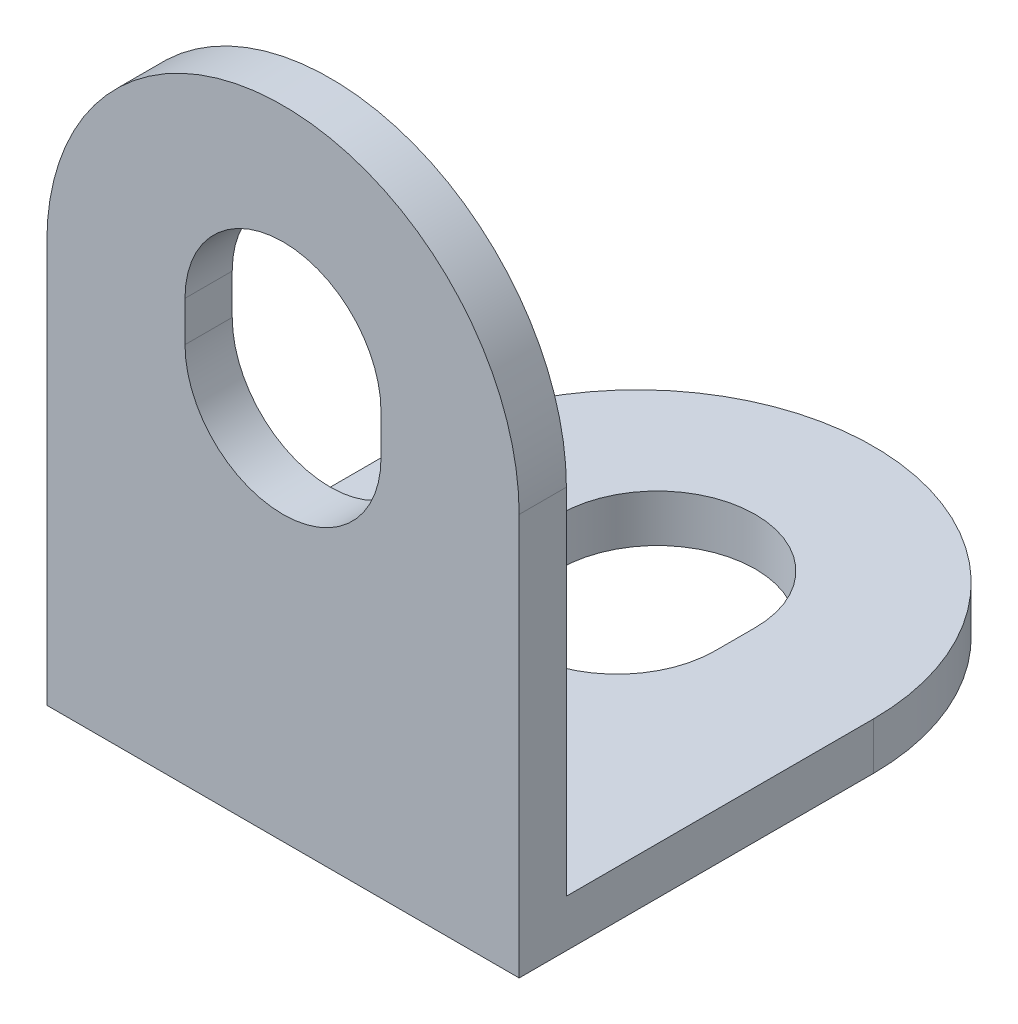
ISO-10303-21;
HEADER;
FILE_DESCRIPTION(('STEP AP214'),'2;1');
FILE_NAME('part.step','',(''),(''),'','','');
FILE_SCHEMA(('AUTOMOTIVE_DESIGN { 1 0 10303 214 1 1 1 1 }'));
ENDSEC;
DATA;
#1=APPLICATION_CONTEXT('core data for automotive mechanical design processes');
#2=APPLICATION_PROTOCOL_DEFINITION('international standard','automotive_design',2000,#1);
#3=PRODUCT_CONTEXT('',#1,'mechanical');
#4=PRODUCT('Part','Part','',(#3));
#5=PRODUCT_RELATED_PRODUCT_CATEGORY('part','',(#4));
#6=PRODUCT_DEFINITION_FORMATION('','',#4);
#7=PRODUCT_DEFINITION_CONTEXT('part definition',#1,'design');
#8=PRODUCT_DEFINITION('design','',#6,#7);
#9=PRODUCT_DEFINITION_SHAPE('','',#8);
#10=(LENGTH_UNIT() NAMED_UNIT(*) SI_UNIT(.MILLI.,.METRE.));
#11=(NAMED_UNIT(*) PLANE_ANGLE_UNIT() SI_UNIT($,.RADIAN.));
#12=(NAMED_UNIT(*) SI_UNIT($,.STERADIAN.) SOLID_ANGLE_UNIT());
#13=UNCERTAINTY_MEASURE_WITH_UNIT(LENGTH_MEASURE(1.E-05),#10,'distance_accuracy_value','');
#14=(GEOMETRIC_REPRESENTATION_CONTEXT(3) GLOBAL_UNCERTAINTY_ASSIGNED_CONTEXT((#13)) GLOBAL_UNIT_ASSIGNED_CONTEXT((#10,
#11,#12)) REPRESENTATION_CONTEXT('',''));
#15=CARTESIAN_POINT('',(0.,0.,0.));
#16=DIRECTION('',(0.,0.,1.));
#17=DIRECTION('',(1.,0.,0.));
#18=AXIS2_PLACEMENT_3D('',#15,#16,#17);
#19=CARTESIAN_POINT('',(0.,1.,0.));
#20=DIRECTION('',(0.,1.,0.));
#21=DIRECTION('',(0.,0.,1.));
#22=AXIS2_PLACEMENT_3D('',#19,#20,#21);
#23=PLANE('',#22);
#24=DIRECTION('',(0.,0.,1.));
#25=VECTOR('',#24,1.);
#26=CARTESIAN_POINT('',(-2.075,1.,-0.425));
#27=LINE('',#26,#25);
#28=CARTESIAN_POINT('',(-2.075,1.,-0.425));
#29=VERTEX_POINT('',#28);
#30=CARTESIAN_POINT('',(-2.075,1.,0.425));
#31=VERTEX_POINT('',#30);
#32=EDGE_CURVE('E197',#29,#31,#27,.T.);
#33=ORIENTED_EDGE('',*,*,#32,.F.);
#34=CARTESIAN_POINT('',(0.,1.,-0.425));
#35=DIRECTION('',(0.,1.,0.));
#36=DIRECTION('',(0.,0.,1.));
#37=AXIS2_PLACEMENT_3D('',#34,#35,#36);
#38=CIRCLE('',#37,2.075);
#39=CARTESIAN_POINT('',(2.075,1.,-0.425));
#40=VERTEX_POINT('',#39);
#41=EDGE_CURVE('E195',#40,#29,#38,.T.);
#42=ORIENTED_EDGE('',*,*,#41,.F.);
#43=DIRECTION('',(0.,0.,-1.));
#44=VECTOR('',#43,1.);
#45=CARTESIAN_POINT('',(2.075,1.,-0.425));
#46=LINE('',#45,#44);
#47=CARTESIAN_POINT('',(2.075,1.,0.425));
#48=VERTEX_POINT('',#47);
#49=EDGE_CURVE('E202',#48,#40,#46,.T.);
#50=ORIENTED_EDGE('',*,*,#49,.F.);
#51=CARTESIAN_POINT('',(0.,1.,0.425));
#52=DIRECTION('',(0.,1.,0.));
#53=DIRECTION('',(0.,0.,1.));
#54=AXIS2_PLACEMENT_3D('',#51,#52,#53);
#55=CIRCLE('',#54,2.075);
#56=EDGE_CURVE('E200',#31,#48,#55,.T.);
#57=ORIENTED_EDGE('',*,*,#56,.F.);
#58=EDGE_LOOP('',(#33,#42,#50,#57));
#59=FACE_BOUND('',#58,.T.);
#60=DIRECTION('',(0.,0.,1.));
#61=VECTOR('',#60,1.);
#62=CARTESIAN_POINT('',(-5.,1.,0.));
#63=LINE('',#62,#61);
#64=CARTESIAN_POINT('',(-5.,1.,0.));
#65=VERTEX_POINT('',#64);
#66=CARTESIAN_POINT('',(-5.,1.,6.5));
#67=VERTEX_POINT('',#66);
#68=EDGE_CURVE('E227',#65,#67,#63,.T.);
#69=ORIENTED_EDGE('',*,*,#68,.T.);
#70=DIRECTION('',(1.,0.,0.));
#71=VECTOR('',#70,1.);
#72=CARTESIAN_POINT('',(-5.,1.,6.5));
#73=LINE('',#72,#71);
#74=CARTESIAN_POINT('',(5.,1.,6.5));
#75=VERTEX_POINT('',#74);
#76=EDGE_CURVE('E186',#67,#75,#73,.T.);
#77=ORIENTED_EDGE('',*,*,#76,.T.);
#78=DIRECTION('',(0.,0.,-1.));
#79=VECTOR('',#78,1.);
#80=CARTESIAN_POINT('',(5.,1.,0.));
#81=LINE('',#80,#79);
#82=CARTESIAN_POINT('',(5.,1.,0.));
#83=VERTEX_POINT('',#82);
#84=EDGE_CURVE('E231',#75,#83,#81,.T.);
#85=ORIENTED_EDGE('',*,*,#84,.T.);
#86=CARTESIAN_POINT('',(0.,1.,0.));
#87=DIRECTION('',(0.,1.,0.));
#88=DIRECTION('',(0.,0.,1.));
#89=AXIS2_PLACEMENT_3D('',#86,#87,#88);
#90=CIRCLE('',#89,5.);
#91=EDGE_CURVE('E224',#83,#65,#90,.T.);
#92=ORIENTED_EDGE('',*,*,#91,.T.);
#93=EDGE_LOOP('',(#69,#77,#85,#92));
#94=FACE_BOUND('',#93,.T.);
#95=ADVANCED_FACE('F33',(#59,#94),#23,.T.);
#96=CARTESIAN_POINT('',(0.,0.,0.));
#97=DIRECTION('',(0.,1.,0.));
#98=DIRECTION('',(0.,0.,1.));
#99=AXIS2_PLACEMENT_3D('',#96,#97,#98);
#100=PLANE('',#99);
#101=CARTESIAN_POINT('',(0.,0.,0.));
#102=DIRECTION('',(0.,1.,0.));
#103=DIRECTION('',(0.,0.,1.));
#104=AXIS2_PLACEMENT_3D('',#101,#102,#103);
#105=CIRCLE('',#104,5.);
#106=CARTESIAN_POINT('',(5.,0.,0.));
#107=VERTEX_POINT('',#106);
#108=CARTESIAN_POINT('',(-5.,0.,0.));
#109=VERTEX_POINT('',#108);
#110=EDGE_CURVE('E223',#107,#109,#105,.T.);
#111=ORIENTED_EDGE('',*,*,#110,.F.);
#112=DIRECTION('',(0.,0.,-1.));
#113=VECTOR('',#112,1.);
#114=CARTESIAN_POINT('',(5.,0.,0.));
#115=LINE('',#114,#113);
#116=CARTESIAN_POINT('',(5.,0.,7.5));
#117=VERTEX_POINT('',#116);
#118=EDGE_CURVE('E228',#117,#107,#115,.T.);
#119=ORIENTED_EDGE('',*,*,#118,.F.);
#120=DIRECTION('',(1.,0.,0.));
#121=VECTOR('',#120,1.);
#122=CARTESIAN_POINT('',(-5.,0.,7.5));
#123=LINE('',#122,#121);
#124=CARTESIAN_POINT('',(-5.,0.,7.5));
#125=VERTEX_POINT('',#124);
#126=EDGE_CURVE('E238',#125,#117,#123,.T.);
#127=ORIENTED_EDGE('',*,*,#126,.F.);
#128=DIRECTION('',(0.,0.,1.));
#129=VECTOR('',#128,1.);
#130=CARTESIAN_POINT('',(-5.,0.,0.));
#131=LINE('',#130,#129);
#132=EDGE_CURVE('E236',#109,#125,#131,.T.);
#133=ORIENTED_EDGE('',*,*,#132,.F.);
#134=EDGE_LOOP('',(#111,#119,#127,#133));
#135=FACE_BOUND('',#134,.T.);
#136=CARTESIAN_POINT('',(0.,0.,-0.425));
#137=DIRECTION('',(0.,1.,0.));
#138=DIRECTION('',(0.,0.,1.));
#139=AXIS2_PLACEMENT_3D('',#136,#137,#138);
#140=CIRCLE('',#139,2.075);
#141=CARTESIAN_POINT('',(2.075,0.,-0.425));
#142=VERTEX_POINT('',#141);
#143=CARTESIAN_POINT('',(-2.075,0.,-0.425));
#144=VERTEX_POINT('',#143);
#145=EDGE_CURVE('E194',#142,#144,#140,.T.);
#146=ORIENTED_EDGE('',*,*,#145,.T.);
#147=DIRECTION('',(0.,0.,1.));
#148=VECTOR('',#147,1.);
#149=CARTESIAN_POINT('',(-2.075,0.,-0.425));
#150=LINE('',#149,#148);
#151=CARTESIAN_POINT('',(-2.075,0.,0.425));
#152=VERTEX_POINT('',#151);
#153=EDGE_CURVE('E207',#144,#152,#150,.T.);
#154=ORIENTED_EDGE('',*,*,#153,.T.);
#155=CARTESIAN_POINT('',(0.,0.,0.425));
#156=DIRECTION('',(0.,1.,0.));
#157=DIRECTION('',(0.,0.,1.));
#158=AXIS2_PLACEMENT_3D('',#155,#156,#157);
#159=CIRCLE('',#158,2.075);
#160=CARTESIAN_POINT('',(2.075,0.,0.425));
#161=VERTEX_POINT('',#160);
#162=EDGE_CURVE('E210',#152,#161,#159,.T.);
#163=ORIENTED_EDGE('',*,*,#162,.T.);
#164=DIRECTION('',(0.,0.,-1.));
#165=VECTOR('',#164,1.);
#166=CARTESIAN_POINT('',(2.075,0.,-0.425));
#167=LINE('',#166,#165);
#168=EDGE_CURVE('E198',#161,#142,#167,.T.);
#169=ORIENTED_EDGE('',*,*,#168,.T.);
#170=EDGE_LOOP('',(#146,#154,#163,#169));
#171=FACE_BOUND('',#170,.T.);
#172=ADVANCED_FACE('F254',(#135,#171),#100,.F.);
#173=CARTESIAN_POINT('',(0.,1.,0.));
#174=DIRECTION('',(0.,-1.,0.));
#175=DIRECTION('',(0.,0.,-1.));
#176=AXIS2_PLACEMENT_3D('',#173,#174,#175);
#177=CYLINDRICAL_SURFACE('',#176,5.);
#178=ORIENTED_EDGE('',*,*,#110,.T.);
#179=DIRECTION('',(0.,-1.,0.));
#180=VECTOR('',#179,1.);
#181=CARTESIAN_POINT('',(-5.,1.,0.));
#182=LINE('',#181,#180);
#183=EDGE_CURVE('E11',#65,#109,#182,.T.);
#184=ORIENTED_EDGE('',*,*,#183,.F.);
#185=ORIENTED_EDGE('',*,*,#91,.F.);
#186=DIRECTION('',(0.,-1.,0.));
#187=VECTOR('',#186,1.);
#188=CARTESIAN_POINT('',(5.,1.,0.));
#189=LINE('',#188,#187);
#190=EDGE_CURVE('E233',#83,#107,#189,.T.);
#191=ORIENTED_EDGE('',*,*,#190,.T.);
#192=EDGE_LOOP('',(#178,#184,#185,#191));
#193=FACE_BOUND('',#192,.T.);
#194=ADVANCED_FACE('F35',(#193),#177,.T.);
#195=CARTESIAN_POINT('',(-5.,1.,0.));
#196=DIRECTION('',(1.,0.,0.));
#197=DIRECTION('',(0.,0.,-1.));
#198=AXIS2_PLACEMENT_3D('',#195,#196,#197);
#199=PLANE('',#198);
#200=ORIENTED_EDGE('',*,*,#132,.T.);
#201=DIRECTION('',(0.,-1.,0.));
#202=VECTOR('',#201,1.);
#203=CARTESIAN_POINT('',(-5.,1.,7.5));
#204=LINE('',#203,#202);
#205=CARTESIAN_POINT('',(-5.,8.5,7.50000000000003));
#206=VERTEX_POINT('',#205);
#207=EDGE_CURVE('E41',#206,#125,#204,.T.);
#208=ORIENTED_EDGE('',*,*,#207,.F.);
#209=DIRECTION('',(0.,0.,-1.));
#210=VECTOR('',#209,1.);
#211=CARTESIAN_POINT('',(-5.,8.5,7.50000000000003));
#212=LINE('',#211,#210);
#213=CARTESIAN_POINT('',(-5.,8.5,6.50000000000003));
#214=VERTEX_POINT('',#213);
#215=EDGE_CURVE('E191',#206,#214,#212,.T.);
#216=ORIENTED_EDGE('',*,*,#215,.T.);
#217=DIRECTION('',(0.,-1.,0.));
#218=VECTOR('',#217,1.);
#219=CARTESIAN_POINT('',(-5.,8.5,6.50000000000003));
#220=LINE('',#219,#218);
#221=EDGE_CURVE('E184',#214,#67,#220,.T.);
#222=ORIENTED_EDGE('',*,*,#221,.T.);
#223=ORIENTED_EDGE('',*,*,#68,.F.);
#224=ORIENTED_EDGE('',*,*,#183,.T.);
#225=EDGE_LOOP('',(#200,#208,#216,#222,#223,#224));
#226=FACE_BOUND('',#225,.T.);
#227=ADVANCED_FACE('F269',(#226),#199,.F.);
#228=CARTESIAN_POINT('',(-5.,1.,7.5));
#229=DIRECTION('',(0.,0.,-1.));
#230=DIRECTION('',(-1.,0.,0.));
#231=AXIS2_PLACEMENT_3D('',#228,#229,#230);
#232=PLANE('',#231);
#233=ORIENTED_EDGE('',*,*,#126,.T.);
#234=DIRECTION('',(0.,-1.,0.));
#235=VECTOR('',#234,1.);
#236=CARTESIAN_POINT('',(5.,1.,7.5));
#237=LINE('',#236,#235);
#238=CARTESIAN_POINT('',(5.,8.5,7.50000000000003));
#239=VERTEX_POINT('',#238);
#240=EDGE_CURVE('E243',#239,#117,#237,.T.);
#241=ORIENTED_EDGE('',*,*,#240,.F.);
#242=CARTESIAN_POINT('',(0.,8.5,7.50000000000003));
#243=DIRECTION('',(0.,0.,1.));
#244=DIRECTION('',(0.,-1.,0.));
#245=AXIS2_PLACEMENT_3D('',#242,#243,#244);
#246=CIRCLE('',#245,5.);
#247=EDGE_CURVE('E178',#239,#206,#246,.T.);
#248=ORIENTED_EDGE('',*,*,#247,.T.);
#249=ORIENTED_EDGE('',*,*,#207,.T.);
#250=EDGE_LOOP('',(#233,#241,#248,#249));
#251=FACE_BOUND('',#250,.T.);
#252=DIRECTION('',(0.,-1.,0.));
#253=VECTOR('',#252,1.);
#254=CARTESIAN_POINT('',(-2.075,8.925,7.50000000000003));
#255=LINE('',#254,#253);
#256=CARTESIAN_POINT('',(-2.075,8.925,7.50000000000003));
#257=VERTEX_POINT('',#256);
#258=CARTESIAN_POINT('',(-2.075,8.075,7.50000000000002));
#259=VERTEX_POINT('',#258);
#260=EDGE_CURVE('E146',#257,#259,#255,.T.);
#261=ORIENTED_EDGE('',*,*,#260,.F.);
#262=CARTESIAN_POINT('',(0.,8.925,7.50000000000003));
#263=DIRECTION('',(0.,0.,1.));
#264=DIRECTION('',(0.,-1.,0.));
#265=AXIS2_PLACEMENT_3D('',#262,#263,#264);
#266=CIRCLE('',#265,2.075);
#267=CARTESIAN_POINT('',(2.075,8.925,7.50000000000003));
#268=VERTEX_POINT('',#267);
#269=EDGE_CURVE('E136',#268,#257,#266,.T.);
#270=ORIENTED_EDGE('',*,*,#269,.F.);
#271=DIRECTION('',(0.,1.,0.));
#272=VECTOR('',#271,1.);
#273=CARTESIAN_POINT('',(2.075,8.925,7.50000000000003));
#274=LINE('',#273,#272);
#275=CARTESIAN_POINT('',(2.075,8.075,7.50000000000002));
#276=VERTEX_POINT('',#275);
#277=EDGE_CURVE('E162',#276,#268,#274,.T.);
#278=ORIENTED_EDGE('',*,*,#277,.F.);
#279=CARTESIAN_POINT('',(0.,8.075,7.50000000000002));
#280=DIRECTION('',(0.,0.,1.));
#281=DIRECTION('',(0.,-1.,0.));
#282=AXIS2_PLACEMENT_3D('',#279,#280,#281);
#283=CIRCLE('',#282,2.075);
#284=EDGE_CURVE('E160',#259,#276,#283,.T.);
#285=ORIENTED_EDGE('',*,*,#284,.F.);
#286=EDGE_LOOP('',(#261,#270,#278,#285));
#287=FACE_BOUND('',#286,.T.);
#288=ADVANCED_FACE('F158',(#251,#287),#232,.F.);
#289=CARTESIAN_POINT('',(5.,1.,0.));
#290=DIRECTION('',(-1.,0.,0.));
#291=DIRECTION('',(0.,0.,1.));
#292=AXIS2_PLACEMENT_3D('',#289,#290,#291);
#293=PLANE('',#292);
#294=ORIENTED_EDGE('',*,*,#118,.T.);
#295=ORIENTED_EDGE('',*,*,#190,.F.);
#296=ORIENTED_EDGE('',*,*,#84,.F.);
#297=DIRECTION('',(0.,1.,0.));
#298=VECTOR('',#297,1.);
#299=CARTESIAN_POINT('',(5.,8.5,6.50000000000003));
#300=LINE('',#299,#298);
#301=CARTESIAN_POINT('',(5.,8.5,6.50000000000003));
#302=VERTEX_POINT('',#301);
#303=EDGE_CURVE('E48',#75,#302,#300,.T.);
#304=ORIENTED_EDGE('',*,*,#303,.T.);
#305=DIRECTION('',(0.,0.,-1.));
#306=VECTOR('',#305,1.);
#307=CARTESIAN_POINT('',(5.,8.5,7.50000000000003));
#308=LINE('',#307,#306);
#309=EDGE_CURVE('E181',#239,#302,#308,.T.);
#310=ORIENTED_EDGE('',*,*,#309,.F.);
#311=ORIENTED_EDGE('',*,*,#240,.T.);
#312=EDGE_LOOP('',(#294,#295,#296,#304,#310,#311));
#313=FACE_BOUND('',#312,.T.);
#314=ADVANCED_FACE('F258',(#313),#293,.F.);
#315=CARTESIAN_POINT('',(0.,1.,-0.425));
#316=DIRECTION('',(0.,-1.,0.));
#317=DIRECTION('',(0.,0.,-1.));
#318=AXIS2_PLACEMENT_3D('',#315,#316,#317);
#319=CYLINDRICAL_SURFACE('',#318,2.075);
#320=ORIENTED_EDGE('',*,*,#145,.F.);
#321=DIRECTION('',(0.,-1.,0.));
#322=VECTOR('',#321,1.);
#323=CARTESIAN_POINT('',(2.075,1.,-0.425));
#324=LINE('',#323,#322);
#325=EDGE_CURVE('E204',#40,#142,#324,.T.);
#326=ORIENTED_EDGE('',*,*,#325,.F.);
#327=ORIENTED_EDGE('',*,*,#41,.T.);
#328=DIRECTION('',(0.,-1.,0.));
#329=VECTOR('',#328,1.);
#330=CARTESIAN_POINT('',(-2.075,1.,-0.425));
#331=LINE('',#330,#329);
#332=EDGE_CURVE('E220',#29,#144,#331,.T.);
#333=ORIENTED_EDGE('',*,*,#332,.T.);
#334=EDGE_LOOP('',(#320,#326,#327,#333));
#335=FACE_BOUND('',#334,.T.);
#336=ADVANCED_FACE('F285',(#335),#319,.F.);
#337=CARTESIAN_POINT('',(-2.075,1.,-0.425));
#338=DIRECTION('',(1.,0.,0.));
#339=DIRECTION('',(0.,0.,-1.));
#340=AXIS2_PLACEMENT_3D('',#337,#338,#339);
#341=PLANE('',#340);
#342=ORIENTED_EDGE('',*,*,#153,.F.);
#343=ORIENTED_EDGE('',*,*,#332,.F.);
#344=ORIENTED_EDGE('',*,*,#32,.T.);
#345=DIRECTION('',(0.,-1.,0.));
#346=VECTOR('',#345,1.);
#347=CARTESIAN_POINT('',(-2.075,1.,0.425));
#348=LINE('',#347,#346);
#349=EDGE_CURVE('E218',#31,#152,#348,.T.);
#350=ORIENTED_EDGE('',*,*,#349,.T.);
#351=EDGE_LOOP('',(#342,#343,#344,#350));
#352=FACE_BOUND('',#351,.T.);
#353=ADVANCED_FACE('F292',(#352),#341,.T.);
#354=CARTESIAN_POINT('',(0.,1.,0.425));
#355=DIRECTION('',(0.,-1.,0.));
#356=DIRECTION('',(0.,0.,-1.));
#357=AXIS2_PLACEMENT_3D('',#354,#355,#356);
#358=CYLINDRICAL_SURFACE('',#357,2.075);
#359=ORIENTED_EDGE('',*,*,#162,.F.);
#360=ORIENTED_EDGE('',*,*,#349,.F.);
#361=ORIENTED_EDGE('',*,*,#56,.T.);
#362=DIRECTION('',(0.,-1.,0.));
#363=VECTOR('',#362,1.);
#364=CARTESIAN_POINT('',(2.075,1.,0.425));
#365=LINE('',#364,#363);
#366=EDGE_CURVE('E56',#48,#161,#365,.T.);
#367=ORIENTED_EDGE('',*,*,#366,.T.);
#368=EDGE_LOOP('',(#359,#360,#361,#367));
#369=FACE_BOUND('',#368,.T.);
#370=ADVANCED_FACE('F297',(#369),#358,.F.);
#371=CARTESIAN_POINT('',(2.075,1.,-0.425));
#372=DIRECTION('',(-1.,0.,0.));
#373=DIRECTION('',(0.,0.,1.));
#374=AXIS2_PLACEMENT_3D('',#371,#372,#373);
#375=PLANE('',#374);
#376=ORIENTED_EDGE('',*,*,#168,.F.);
#377=ORIENTED_EDGE('',*,*,#366,.F.);
#378=ORIENTED_EDGE('',*,*,#49,.T.);
#379=ORIENTED_EDGE('',*,*,#325,.T.);
#380=EDGE_LOOP('',(#376,#377,#378,#379));
#381=FACE_BOUND('',#380,.T.);
#382=ADVANCED_FACE('F302',(#381),#375,.T.);
#383=CARTESIAN_POINT('',(0.,8.5,6.50000000000003));
#384=DIRECTION('',(0.,0.,1.));
#385=DIRECTION('',(0.,-1.,0.));
#386=AXIS2_PLACEMENT_3D('',#383,#384,#385);
#387=PLANE('',#386);
#388=CARTESIAN_POINT('',(0.,8.5,6.50000000000003));
#389=DIRECTION('',(0.,0.,1.));
#390=DIRECTION('',(0.,-1.,0.));
#391=AXIS2_PLACEMENT_3D('',#388,#389,#390);
#392=CIRCLE('',#391,5.);
#393=EDGE_CURVE('E154',#302,#214,#392,.T.);
#394=ORIENTED_EDGE('',*,*,#393,.F.);
#395=ORIENTED_EDGE('',*,*,#303,.F.);
#396=ORIENTED_EDGE('',*,*,#76,.F.);
#397=ORIENTED_EDGE('',*,*,#221,.F.);
#398=EDGE_LOOP('',(#394,#395,#396,#397));
#399=FACE_BOUND('',#398,.T.);
#400=CARTESIAN_POINT('',(0.,8.925,6.50000000000003));
#401=DIRECTION('',(0.,0.,1.));
#402=DIRECTION('',(0.,-1.,0.));
#403=AXIS2_PLACEMENT_3D('',#400,#401,#402);
#404=CIRCLE('',#403,2.075);
#405=CARTESIAN_POINT('',(2.075,8.925,6.50000000000003));
#406=VERTEX_POINT('',#405);
#407=CARTESIAN_POINT('',(-2.075,8.925,6.50000000000003));
#408=VERTEX_POINT('',#407);
#409=EDGE_CURVE('E166',#406,#408,#404,.T.);
#410=ORIENTED_EDGE('',*,*,#409,.T.);
#411=DIRECTION('',(0.,-1.,0.));
#412=VECTOR('',#411,1.);
#413=CARTESIAN_POINT('',(-2.075,8.925,6.50000000000003));
#414=LINE('',#413,#412);
#415=CARTESIAN_POINT('',(-2.075,8.075,6.50000000000002));
#416=VERTEX_POINT('',#415);
#417=EDGE_CURVE('E153',#408,#416,#414,.T.);
#418=ORIENTED_EDGE('',*,*,#417,.T.);
#419=CARTESIAN_POINT('',(0.,8.075,6.50000000000002));
#420=DIRECTION('',(0.,0.,1.));
#421=DIRECTION('',(0.,-1.,0.));
#422=AXIS2_PLACEMENT_3D('',#419,#420,#421);
#423=CIRCLE('',#422,2.075);
#424=CARTESIAN_POINT('',(2.075,8.075,6.50000000000002));
#425=VERTEX_POINT('',#424);
#426=EDGE_CURVE('E169',#416,#425,#423,.T.);
#427=ORIENTED_EDGE('',*,*,#426,.T.);
#428=DIRECTION('',(0.,1.,0.));
#429=VECTOR('',#428,1.);
#430=CARTESIAN_POINT('',(2.075,8.925,6.50000000000003));
#431=LINE('',#430,#429);
#432=EDGE_CURVE('E147',#425,#406,#431,.T.);
#433=ORIENTED_EDGE('',*,*,#432,.T.);
#434=EDGE_LOOP('',(#410,#418,#427,#433));
#435=FACE_BOUND('',#434,.T.);
#436=ADVANCED_FACE('F267',(#399,#435),#387,.F.);
#437=CARTESIAN_POINT('',(0.,8.5,7.50000000000003));
#438=DIRECTION('',(0.,0.,-1.));
#439=DIRECTION('',(0.,1.,0.));
#440=AXIS2_PLACEMENT_3D('',#437,#438,#439);
#441=CYLINDRICAL_SURFACE('',#440,5.);
#442=ORIENTED_EDGE('',*,*,#393,.T.);
#443=ORIENTED_EDGE('',*,*,#215,.F.);
#444=ORIENTED_EDGE('',*,*,#247,.F.);
#445=ORIENTED_EDGE('',*,*,#309,.T.);
#446=EDGE_LOOP('',(#442,#443,#444,#445));
#447=FACE_BOUND('',#446,.T.);
#448=ADVANCED_FACE('F266',(#447),#441,.T.);
#449=CARTESIAN_POINT('',(0.,8.925,7.50000000000003));
#450=DIRECTION('',(0.,0.,-1.));
#451=DIRECTION('',(0.,1.,0.));
#452=AXIS2_PLACEMENT_3D('',#449,#450,#451);
#453=CYLINDRICAL_SURFACE('',#452,2.075);
#454=ORIENTED_EDGE('',*,*,#409,.F.);
#455=DIRECTION('',(0.,0.,-1.));
#456=VECTOR('',#455,1.);
#457=CARTESIAN_POINT('',(2.075,8.925,7.50000000000003));
#458=LINE('',#457,#456);
#459=EDGE_CURVE('E142',#268,#406,#458,.T.);
#460=ORIENTED_EDGE('',*,*,#459,.F.);
#461=ORIENTED_EDGE('',*,*,#269,.T.);
#462=DIRECTION('',(0.,0.,-1.));
#463=VECTOR('',#462,1.);
#464=CARTESIAN_POINT('',(-2.075,8.925,7.50000000000003));
#465=LINE('',#464,#463);
#466=EDGE_CURVE('E139',#257,#408,#465,.T.);
#467=ORIENTED_EDGE('',*,*,#466,.T.);
#468=EDGE_LOOP('',(#454,#460,#461,#467));
#469=FACE_BOUND('',#468,.T.);
#470=ADVANCED_FACE('F138',(#469),#453,.F.);
#471=CARTESIAN_POINT('',(-2.075,8.925,7.50000000000003));
#472=DIRECTION('',(1.,0.,0.));
#473=DIRECTION('',(0.,0.,-1.));
#474=AXIS2_PLACEMENT_3D('',#471,#472,#473);
#475=PLANE('',#474);
#476=ORIENTED_EDGE('',*,*,#417,.F.);
#477=ORIENTED_EDGE('',*,*,#466,.F.);
#478=ORIENTED_EDGE('',*,*,#260,.T.);
#479=DIRECTION('',(0.,0.,-1.));
#480=VECTOR('',#479,1.);
#481=CARTESIAN_POINT('',(-2.075,8.075,7.50000000000002));
#482=LINE('',#481,#480);
#483=EDGE_CURVE('E155',#259,#416,#482,.T.);
#484=ORIENTED_EDGE('',*,*,#483,.T.);
#485=EDGE_LOOP('',(#476,#477,#478,#484));
#486=FACE_BOUND('',#485,.T.);
#487=ADVANCED_FACE('F150',(#486),#475,.T.);
#488=CARTESIAN_POINT('',(0.,8.075,7.50000000000002));
#489=DIRECTION('',(0.,0.,-1.));
#490=DIRECTION('',(0.,1.,0.));
#491=AXIS2_PLACEMENT_3D('',#488,#489,#490);
#492=CYLINDRICAL_SURFACE('',#491,2.075);
#493=ORIENTED_EDGE('',*,*,#426,.F.);
#494=ORIENTED_EDGE('',*,*,#483,.F.);
#495=ORIENTED_EDGE('',*,*,#284,.T.);
#496=DIRECTION('',(0.,0.,-1.));
#497=VECTOR('',#496,1.);
#498=CARTESIAN_POINT('',(2.075,8.075,7.50000000000002));
#499=LINE('',#498,#497);
#500=EDGE_CURVE('E175',#276,#425,#499,.T.);
#501=ORIENTED_EDGE('',*,*,#500,.T.);
#502=EDGE_LOOP('',(#493,#494,#495,#501));
#503=FACE_BOUND('',#502,.T.);
#504=ADVANCED_FACE('F323',(#503),#492,.F.);
#505=CARTESIAN_POINT('',(2.075,8.925,7.50000000000003));
#506=DIRECTION('',(-1.,0.,0.));
#507=DIRECTION('',(0.,0.,1.));
#508=AXIS2_PLACEMENT_3D('',#505,#506,#507);
#509=PLANE('',#508);
#510=ORIENTED_EDGE('',*,*,#432,.F.);
#511=ORIENTED_EDGE('',*,*,#500,.F.);
#512=ORIENTED_EDGE('',*,*,#277,.T.);
#513=ORIENTED_EDGE('',*,*,#459,.T.);
#514=EDGE_LOOP('',(#510,#511,#512,#513));
#515=FACE_BOUND('',#514,.T.);
#516=ADVANCED_FACE('F326',(#515),#509,.T.);
#517=CLOSED_SHELL('',(#95,#172,#194,#227,#288,#314,#336,#353,#370,#382,#436,#448,#470,#487,#504,#516));
#518=MANIFOLD_SOLID_BREP('B2',#517);
#519=ADVANCED_BREP_SHAPE_REPRESENTATION('',(#18,#518),#14);
#520=SHAPE_DEFINITION_REPRESENTATION(#9,#519);
ENDSEC;
END-ISO-10303-21;
